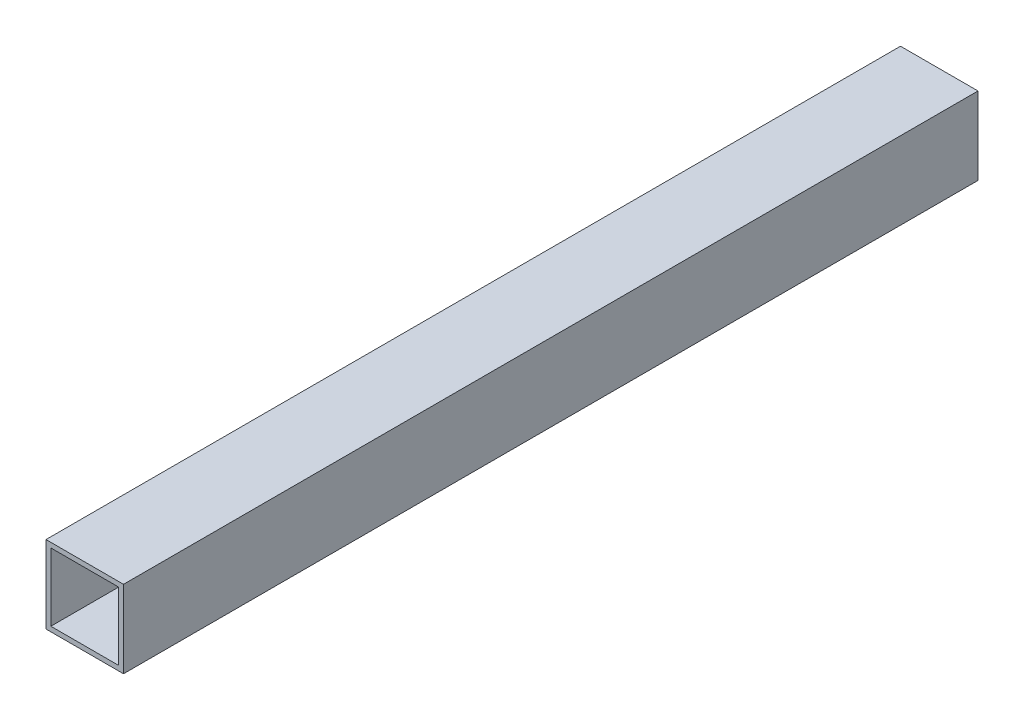
ISO-10303-21;
HEADER;
FILE_DESCRIPTION(('STEP AP214'),'2;1');
FILE_NAME('part.step','',(''),(''),'','','');
FILE_SCHEMA(('AUTOMOTIVE_DESIGN { 1 0 10303 214 1 1 1 1 }'));
ENDSEC;
DATA;
#1=APPLICATION_CONTEXT('core data for automotive mechanical design processes');
#2=APPLICATION_PROTOCOL_DEFINITION('international standard','automotive_design',2000,#1);
#3=PRODUCT_CONTEXT('',#1,'mechanical');
#4=PRODUCT('Part','Part','',(#3));
#5=PRODUCT_RELATED_PRODUCT_CATEGORY('part','',(#4));
#6=PRODUCT_DEFINITION_FORMATION('','',#4);
#7=PRODUCT_DEFINITION_CONTEXT('part definition',#1,'design');
#8=PRODUCT_DEFINITION('design','',#6,#7);
#9=PRODUCT_DEFINITION_SHAPE('','',#8);
#10=(LENGTH_UNIT() NAMED_UNIT(*) SI_UNIT(.MILLI.,.METRE.));
#11=(NAMED_UNIT(*) PLANE_ANGLE_UNIT() SI_UNIT($,.RADIAN.));
#12=(NAMED_UNIT(*) SI_UNIT($,.STERADIAN.) SOLID_ANGLE_UNIT());
#13=UNCERTAINTY_MEASURE_WITH_UNIT(LENGTH_MEASURE(1.E-05),#10,'distance_accuracy_value','');
#14=(GEOMETRIC_REPRESENTATION_CONTEXT(3) GLOBAL_UNCERTAINTY_ASSIGNED_CONTEXT((#13)) GLOBAL_UNIT_ASSIGNED_CONTEXT((#10,
#11,#12)) REPRESENTATION_CONTEXT('',''));
#15=CARTESIAN_POINT('',(0.,0.,0.));
#16=DIRECTION('',(0.,0.,1.));
#17=DIRECTION('',(1.,0.,0.));
#18=AXIS2_PLACEMENT_3D('',#15,#16,#17);
#19=CARTESIAN_POINT('',(0.,0.,280.));
#20=DIRECTION('',(0.,0.,-1.));
#21=DIRECTION('',(-1.,0.,0.));
#22=AXIS2_PLACEMENT_3D('',#19,#20,#21);
#23=PLANE('',#22);
#24=DIRECTION('',(0.,1.,0.));
#25=VECTOR('',#24,1.);
#26=CARTESIAN_POINT('',(12.7,-12.7,280.));
#27=LINE('',#26,#25);
#28=CARTESIAN_POINT('',(12.7,-12.7,280.));
#29=VERTEX_POINT('',#28);
#30=CARTESIAN_POINT('',(12.7,12.7,280.));
#31=VERTEX_POINT('',#30);
#32=EDGE_CURVE('E133',#29,#31,#27,.T.);
#33=ORIENTED_EDGE('',*,*,#32,.T.);
#34=DIRECTION('',(-1.,0.,0.));
#35=VECTOR('',#34,1.);
#36=CARTESIAN_POINT('',(-12.7,12.7,280.));
#37=LINE('',#36,#35);
#38=CARTESIAN_POINT('',(-12.7,12.7,280.));
#39=VERTEX_POINT('',#38);
#40=EDGE_CURVE('E136',#31,#39,#37,.T.);
#41=ORIENTED_EDGE('',*,*,#40,.T.);
#42=DIRECTION('',(0.,-1.,0.));
#43=VECTOR('',#42,1.);
#44=CARTESIAN_POINT('',(-12.7,-12.7,280.));
#45=LINE('',#44,#43);
#46=CARTESIAN_POINT('',(-12.7,-12.7,280.));
#47=VERTEX_POINT('',#46);
#48=EDGE_CURVE('E139',#39,#47,#45,.T.);
#49=ORIENTED_EDGE('',*,*,#48,.T.);
#50=DIRECTION('',(1.,0.,0.));
#51=VECTOR('',#50,1.);
#52=CARTESIAN_POINT('',(-12.7,-12.7,280.));
#53=LINE('',#52,#51);
#54=EDGE_CURVE('E141',#47,#29,#53,.T.);
#55=ORIENTED_EDGE('',*,*,#54,.T.);
#56=EDGE_LOOP('',(#33,#41,#49,#55));
#57=FACE_BOUND('',#56,.T.);
#58=DIRECTION('',(0.,1.,0.));
#59=VECTOR('',#58,1.);
#60=CARTESIAN_POINT('',(11.1125,-11.1125000000001,280.));
#61=LINE('',#60,#59);
#62=CARTESIAN_POINT('',(11.1125,-11.1125000000001,280.));
#63=VERTEX_POINT('',#62);
#64=CARTESIAN_POINT('',(11.1125,11.1125,280.));
#65=VERTEX_POINT('',#64);
#66=EDGE_CURVE('E97',#63,#65,#61,.T.);
#67=ORIENTED_EDGE('',*,*,#66,.F.);
#68=DIRECTION('',(1.,0.,0.));
#69=VECTOR('',#68,1.);
#70=CARTESIAN_POINT('',(-11.1125,-11.1125000000001,280.));
#71=LINE('',#70,#69);
#72=CARTESIAN_POINT('',(-11.1125,-11.1125000000001,280.));
#73=VERTEX_POINT('',#72);
#74=EDGE_CURVE('E119',#73,#63,#71,.T.);
#75=ORIENTED_EDGE('',*,*,#74,.F.);
#76=DIRECTION('',(0.,-1.,0.));
#77=VECTOR('',#76,1.);
#78=CARTESIAN_POINT('',(-11.1125,-11.1125000000001,280.));
#79=LINE('',#78,#77);
#80=CARTESIAN_POINT('',(-11.1125,11.1125,280.));
#81=VERTEX_POINT('',#80);
#82=EDGE_CURVE('E117',#81,#73,#79,.T.);
#83=ORIENTED_EDGE('',*,*,#82,.F.);
#84=DIRECTION('',(-1.,0.,0.));
#85=VECTOR('',#84,1.);
#86=CARTESIAN_POINT('',(-11.1125,11.1125,280.));
#87=LINE('',#86,#85);
#88=EDGE_CURVE('E105',#65,#81,#87,.T.);
#89=ORIENTED_EDGE('',*,*,#88,.F.);
#90=EDGE_LOOP('',(#67,#75,#83,#89));
#91=FACE_BOUND('',#90,.T.);
#92=ADVANCED_FACE('F32',(#57,#91),#23,.F.);
#93=CARTESIAN_POINT('',(0.,0.,0.));
#94=DIRECTION('',(0.,0.,-1.));
#95=DIRECTION('',(-1.,0.,0.));
#96=AXIS2_PLACEMENT_3D('',#93,#94,#95);
#97=PLANE('',#96);
#98=DIRECTION('',(0.,1.,0.));
#99=VECTOR('',#98,1.);
#100=CARTESIAN_POINT('',(12.7,-12.7,0.));
#101=LINE('',#100,#99);
#102=CARTESIAN_POINT('',(12.7,-12.7,0.));
#103=VERTEX_POINT('',#102);
#104=CARTESIAN_POINT('',(12.7,12.7,0.));
#105=VERTEX_POINT('',#104);
#106=EDGE_CURVE('E113',#103,#105,#101,.T.);
#107=ORIENTED_EDGE('',*,*,#106,.F.);
#108=DIRECTION('',(1.,0.,0.));
#109=VECTOR('',#108,1.);
#110=CARTESIAN_POINT('',(-12.7,-12.7,0.));
#111=LINE('',#110,#109);
#112=CARTESIAN_POINT('',(-12.7,-12.7,0.));
#113=VERTEX_POINT('',#112);
#114=EDGE_CURVE('E137',#113,#103,#111,.T.);
#115=ORIENTED_EDGE('',*,*,#114,.F.);
#116=DIRECTION('',(0.,-1.,0.));
#117=VECTOR('',#116,1.);
#118=CARTESIAN_POINT('',(-12.7,-12.7,0.));
#119=LINE('',#118,#117);
#120=CARTESIAN_POINT('',(-12.7,12.7,0.));
#121=VERTEX_POINT('',#120);
#122=EDGE_CURVE('E148',#121,#113,#119,.T.);
#123=ORIENTED_EDGE('',*,*,#122,.F.);
#124=DIRECTION('',(-1.,0.,0.));
#125=VECTOR('',#124,1.);
#126=CARTESIAN_POINT('',(-12.7,12.7,0.));
#127=LINE('',#126,#125);
#128=EDGE_CURVE('E146',#105,#121,#127,.T.);
#129=ORIENTED_EDGE('',*,*,#128,.F.);
#130=EDGE_LOOP('',(#107,#115,#123,#129));
#131=FACE_BOUND('',#130,.T.);
#132=DIRECTION('',(1.,0.,0.));
#133=VECTOR('',#132,1.);
#134=CARTESIAN_POINT('',(-11.1125,-11.1125000000001,0.));
#135=LINE('',#134,#133);
#136=CARTESIAN_POINT('',(-11.1125,-11.1125000000001,0.));
#137=VERTEX_POINT('',#136);
#138=CARTESIAN_POINT('',(11.1125,-11.1125000000001,0.));
#139=VERTEX_POINT('',#138);
#140=EDGE_CURVE('E106',#137,#139,#135,.T.);
#141=ORIENTED_EDGE('',*,*,#140,.T.);
#142=DIRECTION('',(0.,1.,0.));
#143=VECTOR('',#142,1.);
#144=CARTESIAN_POINT('',(11.1125,-11.1125000000001,0.));
#145=LINE('',#144,#143);
#146=CARTESIAN_POINT('',(11.1125,11.1125,0.));
#147=VERTEX_POINT('',#146);
#148=EDGE_CURVE('E55',#139,#147,#145,.T.);
#149=ORIENTED_EDGE('',*,*,#148,.T.);
#150=DIRECTION('',(-1.,0.,0.));
#151=VECTOR('',#150,1.);
#152=CARTESIAN_POINT('',(-11.1125,11.1125,0.));
#153=LINE('',#152,#151);
#154=CARTESIAN_POINT('',(-11.1125,11.1125,0.));
#155=VERTEX_POINT('',#154);
#156=EDGE_CURVE('E112',#147,#155,#153,.T.);
#157=ORIENTED_EDGE('',*,*,#156,.T.);
#158=DIRECTION('',(0.,-1.,0.));
#159=VECTOR('',#158,1.);
#160=CARTESIAN_POINT('',(-11.1125,-11.1125000000001,0.));
#161=LINE('',#160,#159);
#162=EDGE_CURVE('E125',#155,#137,#161,.T.);
#163=ORIENTED_EDGE('',*,*,#162,.T.);
#164=EDGE_LOOP('',(#141,#149,#157,#163));
#165=FACE_BOUND('',#164,.T.);
#166=ADVANCED_FACE('F166',(#131,#165),#97,.T.);
#167=CARTESIAN_POINT('',(12.7,-12.7,280.));
#168=DIRECTION('',(-1.,0.,0.));
#169=DIRECTION('',(0.,0.,1.));
#170=AXIS2_PLACEMENT_3D('',#167,#168,#169);
#171=PLANE('',#170);
#172=ORIENTED_EDGE('',*,*,#106,.T.);
#173=DIRECTION('',(0.,0.,-1.));
#174=VECTOR('',#173,1.);
#175=CARTESIAN_POINT('',(12.7,12.7,280.));
#176=LINE('',#175,#174);
#177=EDGE_CURVE('E11',#31,#105,#176,.T.);
#178=ORIENTED_EDGE('',*,*,#177,.F.);
#179=ORIENTED_EDGE('',*,*,#32,.F.);
#180=DIRECTION('',(0.,0.,-1.));
#181=VECTOR('',#180,1.);
#182=CARTESIAN_POINT('',(12.7,-12.7,280.));
#183=LINE('',#182,#181);
#184=EDGE_CURVE('E143',#29,#103,#183,.T.);
#185=ORIENTED_EDGE('',*,*,#184,.T.);
#186=EDGE_LOOP('',(#172,#178,#179,#185));
#187=FACE_BOUND('',#186,.T.);
#188=ADVANCED_FACE('F34',(#187),#171,.F.);
#189=CARTESIAN_POINT('',(-12.7,12.7,280.));
#190=DIRECTION('',(0.,-1.,0.));
#191=DIRECTION('',(0.,0.,-1.));
#192=AXIS2_PLACEMENT_3D('',#189,#190,#191);
#193=PLANE('',#192);
#194=ORIENTED_EDGE('',*,*,#128,.T.);
#195=DIRECTION('',(0.,0.,-1.));
#196=VECTOR('',#195,1.);
#197=CARTESIAN_POINT('',(-12.7,12.7,280.));
#198=LINE('',#197,#196);
#199=EDGE_CURVE('E40',#39,#121,#198,.T.);
#200=ORIENTED_EDGE('',*,*,#199,.F.);
#201=ORIENTED_EDGE('',*,*,#40,.F.);
#202=ORIENTED_EDGE('',*,*,#177,.T.);
#203=EDGE_LOOP('',(#194,#200,#201,#202));
#204=FACE_BOUND('',#203,.T.);
#205=ADVANCED_FACE('F176',(#204),#193,.F.);
#206=CARTESIAN_POINT('',(-12.7,-12.7,280.));
#207=DIRECTION('',(1.,0.,0.));
#208=DIRECTION('',(0.,0.,-1.));
#209=AXIS2_PLACEMENT_3D('',#206,#207,#208);
#210=PLANE('',#209);
#211=ORIENTED_EDGE('',*,*,#122,.T.);
#212=DIRECTION('',(0.,0.,-1.));
#213=VECTOR('',#212,1.);
#214=CARTESIAN_POINT('',(-12.7,-12.7,280.));
#215=LINE('',#214,#213);
#216=EDGE_CURVE('E153',#47,#113,#215,.T.);
#217=ORIENTED_EDGE('',*,*,#216,.F.);
#218=ORIENTED_EDGE('',*,*,#48,.F.);
#219=ORIENTED_EDGE('',*,*,#199,.T.);
#220=EDGE_LOOP('',(#211,#217,#218,#219));
#221=FACE_BOUND('',#220,.T.);
#222=ADVANCED_FACE('F160',(#221),#210,.F.);
#223=CARTESIAN_POINT('',(-12.7,-12.7,280.));
#224=DIRECTION('',(0.,1.,0.));
#225=DIRECTION('',(0.,0.,1.));
#226=AXIS2_PLACEMENT_3D('',#223,#224,#225);
#227=PLANE('',#226);
#228=ORIENTED_EDGE('',*,*,#114,.T.);
#229=ORIENTED_EDGE('',*,*,#184,.F.);
#230=ORIENTED_EDGE('',*,*,#54,.F.);
#231=ORIENTED_EDGE('',*,*,#216,.T.);
#232=EDGE_LOOP('',(#228,#229,#230,#231));
#233=FACE_BOUND('',#232,.T.);
#234=ADVANCED_FACE('F170',(#233),#227,.F.);
#235=CARTESIAN_POINT('',(11.1125,-11.1125000000001,280.));
#236=DIRECTION('',(-1.,0.,0.));
#237=DIRECTION('',(0.,0.,1.));
#238=AXIS2_PLACEMENT_3D('',#235,#236,#237);
#239=PLANE('',#238);
#240=ORIENTED_EDGE('',*,*,#148,.F.);
#241=DIRECTION('',(0.,0.,-1.));
#242=VECTOR('',#241,1.);
#243=CARTESIAN_POINT('',(11.1125,-11.1125000000001,280.));
#244=LINE('',#243,#242);
#245=EDGE_CURVE('E101',#63,#139,#244,.T.);
#246=ORIENTED_EDGE('',*,*,#245,.F.);
#247=ORIENTED_EDGE('',*,*,#66,.T.);
#248=DIRECTION('',(0.,0.,-1.));
#249=VECTOR('',#248,1.);
#250=CARTESIAN_POINT('',(11.1125,11.1125,280.));
#251=LINE('',#250,#249);
#252=EDGE_CURVE('E100',#65,#147,#251,.T.);
#253=ORIENTED_EDGE('',*,*,#252,.T.);
#254=EDGE_LOOP('',(#240,#246,#247,#253));
#255=FACE_BOUND('',#254,.T.);
#256=ADVANCED_FACE('F99',(#255),#239,.T.);
#257=CARTESIAN_POINT('',(-11.1125,11.1125,280.));
#258=DIRECTION('',(0.,-1.,0.));
#259=DIRECTION('',(1.,0.,0.));
#260=AXIS2_PLACEMENT_3D('',#257,#258,#259);
#261=PLANE('',#260);
#262=ORIENTED_EDGE('',*,*,#156,.F.);
#263=ORIENTED_EDGE('',*,*,#252,.F.);
#264=ORIENTED_EDGE('',*,*,#88,.T.);
#265=DIRECTION('',(0.,0.,-1.));
#266=VECTOR('',#265,1.);
#267=CARTESIAN_POINT('',(-11.1125,11.1125,280.));
#268=LINE('',#267,#266);
#269=EDGE_CURVE('E114',#81,#155,#268,.T.);
#270=ORIENTED_EDGE('',*,*,#269,.T.);
#271=EDGE_LOOP('',(#262,#263,#264,#270));
#272=FACE_BOUND('',#271,.T.);
#273=ADVANCED_FACE('F109',(#272),#261,.T.);
#274=CARTESIAN_POINT('',(-11.1125,-11.1125000000001,280.));
#275=DIRECTION('',(1.,0.,0.));
#276=DIRECTION('',(0.,0.,-1.));
#277=AXIS2_PLACEMENT_3D('',#274,#275,#276);
#278=PLANE('',#277);
#279=ORIENTED_EDGE('',*,*,#162,.F.);
#280=ORIENTED_EDGE('',*,*,#269,.F.);
#281=ORIENTED_EDGE('',*,*,#82,.T.);
#282=DIRECTION('',(0.,0.,-1.));
#283=VECTOR('',#282,1.);
#284=CARTESIAN_POINT('',(-11.1125,-11.1125000000001,280.));
#285=LINE('',#284,#283);
#286=EDGE_CURVE('E47',#73,#137,#285,.T.);
#287=ORIENTED_EDGE('',*,*,#286,.T.);
#288=EDGE_LOOP('',(#279,#280,#281,#287));
#289=FACE_BOUND('',#288,.T.);
#290=ADVANCED_FACE('F199',(#289),#278,.T.);
#291=CARTESIAN_POINT('',(-11.1125,-11.1125000000001,280.));
#292=DIRECTION('',(0.,1.,0.));
#293=DIRECTION('',(0.,0.,1.));
#294=AXIS2_PLACEMENT_3D('',#291,#292,#293);
#295=PLANE('',#294);
#296=ORIENTED_EDGE('',*,*,#140,.F.);
#297=ORIENTED_EDGE('',*,*,#286,.F.);
#298=ORIENTED_EDGE('',*,*,#74,.T.);
#299=ORIENTED_EDGE('',*,*,#245,.T.);
#300=EDGE_LOOP('',(#296,#297,#298,#299));
#301=FACE_BOUND('',#300,.T.);
#302=ADVANCED_FACE('F203',(#301),#295,.T.);
#303=CLOSED_SHELL('',(#92,#166,#188,#205,#222,#234,#256,#273,#290,#302));
#304=MANIFOLD_SOLID_BREP('B2',#303);
#305=ADVANCED_BREP_SHAPE_REPRESENTATION('',(#18,#304),#14);
#306=SHAPE_DEFINITION_REPRESENTATION(#9,#305);
ENDSEC;
END-ISO-10303-21;
